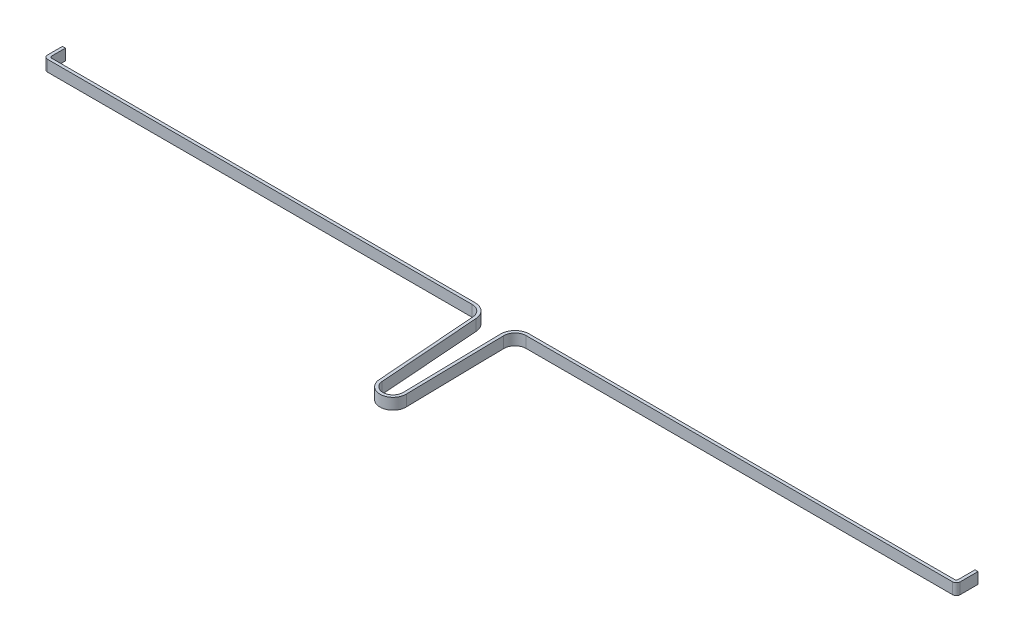
ISO-10303-21;
HEADER;
FILE_DESCRIPTION(('STEP AP214'),'2;1');
FILE_NAME('part.step','',(''),(''),'','','');
FILE_SCHEMA(('AUTOMOTIVE_DESIGN { 1 0 10303 214 1 1 1 1 }'));
ENDSEC;
DATA;
#1=APPLICATION_CONTEXT('core data for automotive mechanical design processes');
#2=APPLICATION_PROTOCOL_DEFINITION('international standard','automotive_design',2000,#1);
#3=PRODUCT_CONTEXT('',#1,'mechanical');
#4=PRODUCT('Part','Part','',(#3));
#5=PRODUCT_RELATED_PRODUCT_CATEGORY('part','',(#4));
#6=PRODUCT_DEFINITION_FORMATION('','',#4);
#7=PRODUCT_DEFINITION_CONTEXT('part definition',#1,'design');
#8=PRODUCT_DEFINITION('design','',#6,#7);
#9=PRODUCT_DEFINITION_SHAPE('','',#8);
#10=(LENGTH_UNIT() NAMED_UNIT(*) SI_UNIT(.MILLI.,.METRE.));
#11=(NAMED_UNIT(*) PLANE_ANGLE_UNIT() SI_UNIT($,.RADIAN.));
#12=(NAMED_UNIT(*) SI_UNIT($,.STERADIAN.) SOLID_ANGLE_UNIT());
#13=UNCERTAINTY_MEASURE_WITH_UNIT(LENGTH_MEASURE(1.E-05),#10,'distance_accuracy_value','');
#14=(GEOMETRIC_REPRESENTATION_CONTEXT(3) GLOBAL_UNCERTAINTY_ASSIGNED_CONTEXT((#13)) GLOBAL_UNIT_ASSIGNED_CONTEXT((#10,
#11,#12)) REPRESENTATION_CONTEXT('',''));
#15=CARTESIAN_POINT('',(0.,0.,0.));
#16=DIRECTION('',(0.,0.,1.));
#17=DIRECTION('',(1.,0.,0.));
#18=AXIS2_PLACEMENT_3D('',#15,#16,#17);
#19=CARTESIAN_POINT('',(-245.4,6.,0.));
#20=DIRECTION('',(1.,0.,0.));
#21=DIRECTION('',(0.,0.,-1.));
#22=AXIS2_PLACEMENT_3D('',#19,#20,#21);
#23=PLANE('',#22);
#24=DIRECTION('',(0.,0.,1.));
#25=VECTOR('',#24,1.);
#26=CARTESIAN_POINT('',(-245.4,6.,0.));
#27=LINE('',#26,#25);
#28=CARTESIAN_POINT('',(-245.4,6.,-69.5));
#29=VERTEX_POINT('',#28);
#30=CARTESIAN_POINT('',(-245.4,6.,-62.1));
#31=VERTEX_POINT('',#30);
#32=EDGE_CURVE('E199',#29,#31,#27,.T.);
#33=ORIENTED_EDGE('',*,*,#32,.T.);
#34=DIRECTION('',(0.,-1.,0.));
#35=VECTOR('',#34,1.);
#36=CARTESIAN_POINT('',(-245.4,6.,-62.1));
#37=LINE('',#36,#35);
#38=CARTESIAN_POINT('',(-245.4,0.,-62.1));
#39=VERTEX_POINT('',#38);
#40=EDGE_CURVE('E207',#31,#39,#37,.T.);
#41=ORIENTED_EDGE('',*,*,#40,.T.);
#42=DIRECTION('',(0.,0.,1.));
#43=VECTOR('',#42,1.);
#44=CARTESIAN_POINT('',(-245.4,0.,0.));
#45=LINE('',#44,#43);
#46=CARTESIAN_POINT('',(-245.4,0.,-69.5));
#47=VERTEX_POINT('',#46);
#48=EDGE_CURVE('E202',#47,#39,#45,.T.);
#49=ORIENTED_EDGE('',*,*,#48,.F.);
#50=DIRECTION('',(0.,-1.,0.));
#51=VECTOR('',#50,1.);
#52=CARTESIAN_POINT('',(-245.4,6.,-69.5));
#53=LINE('',#52,#51);
#54=EDGE_CURVE('E196',#29,#47,#53,.T.);
#55=ORIENTED_EDGE('',*,*,#54,.F.);
#56=EDGE_LOOP('',(#33,#41,#49,#55));
#57=FACE_BOUND('',#56,.T.);
#58=ADVANCED_FACE('F35',(#57),#23,.T.);
#59=CARTESIAN_POINT('',(0.,6.,-69.5));
#60=DIRECTION('',(0.,0.,-1.));
#61=DIRECTION('',(-1.,0.,0.));
#62=AXIS2_PLACEMENT_3D('',#59,#60,#61);
#63=PLANE('',#62);
#64=DIRECTION('',(1.,0.,0.));
#65=VECTOR('',#64,1.);
#66=CARTESIAN_POINT('',(0.,0.,-69.5));
#67=LINE('',#66,#65);
#68=CARTESIAN_POINT('',(-247.,0.,-69.5));
#69=VERTEX_POINT('',#68);
#70=EDGE_CURVE('E269',#69,#47,#67,.T.);
#71=ORIENTED_EDGE('',*,*,#70,.F.);
#72=DIRECTION('',(0.,-1.,0.));
#73=VECTOR('',#72,1.);
#74=CARTESIAN_POINT('',(-247.,6.,-69.5));
#75=LINE('',#74,#73);
#76=CARTESIAN_POINT('',(-247.,6.,-69.5));
#77=VERTEX_POINT('',#76);
#78=EDGE_CURVE('E208',#77,#69,#75,.T.);
#79=ORIENTED_EDGE('',*,*,#78,.F.);
#80=DIRECTION('',(1.,0.,0.));
#81=VECTOR('',#80,1.);
#82=CARTESIAN_POINT('',(0.,6.,-69.5));
#83=LINE('',#82,#81);
#84=EDGE_CURVE('E213',#77,#29,#83,.T.);
#85=ORIENTED_EDGE('',*,*,#84,.T.);
#86=ORIENTED_EDGE('',*,*,#54,.T.);
#87=EDGE_LOOP('',(#71,#79,#85,#86));
#88=FACE_BOUND('',#87,.T.);
#89=ADVANCED_FACE('F220',(#88),#63,.T.);
#90=CARTESIAN_POINT('',(-247.,6.,0.));
#91=DIRECTION('',(-1.,0.,0.));
#92=DIRECTION('',(0.,0.,1.));
#93=AXIS2_PLACEMENT_3D('',#90,#91,#92);
#94=PLANE('',#93);
#95=DIRECTION('',(0.,0.,-1.));
#96=VECTOR('',#95,1.);
#97=CARTESIAN_POINT('',(-247.,0.,0.));
#98=LINE('',#97,#96);
#99=CARTESIAN_POINT('',(-247.,0.,-61.5));
#100=VERTEX_POINT('',#99);
#101=EDGE_CURVE('E271',#100,#69,#98,.T.);
#102=ORIENTED_EDGE('',*,*,#101,.F.);
#103=DIRECTION('',(0.,-1.,0.));
#104=VECTOR('',#103,1.);
#105=CARTESIAN_POINT('',(-247.,6.,-61.5));
#106=LINE('',#105,#104);
#107=CARTESIAN_POINT('',(-247.,6.,-61.5));
#108=VERTEX_POINT('',#107);
#109=EDGE_CURVE('E11',#100,#108,#106,.F.);
#110=ORIENTED_EDGE('',*,*,#109,.T.);
#111=DIRECTION('',(0.,0.,-1.));
#112=VECTOR('',#111,1.);
#113=CARTESIAN_POINT('',(-247.,6.,0.));
#114=LINE('',#113,#112);
#115=EDGE_CURVE('E222',#108,#77,#114,.T.);
#116=ORIENTED_EDGE('',*,*,#115,.T.);
#117=ORIENTED_EDGE('',*,*,#78,.T.);
#118=EDGE_LOOP('',(#102,#110,#116,#117));
#119=FACE_BOUND('',#118,.T.);
#120=ADVANCED_FACE('F467',(#119),#94,.T.);
#121=CARTESIAN_POINT('',(0.,6.,-59.5));
#122=DIRECTION('',(0.,0.,1.));
#123=DIRECTION('',(1.,0.,0.));
#124=AXIS2_PLACEMENT_3D('',#121,#122,#123);
#125=PLANE('',#124);
#126=DIRECTION('',(-1.,0.,0.));
#127=VECTOR('',#126,1.);
#128=CARTESIAN_POINT('',(0.,6.,-59.5));
#129=LINE('',#128,#127);
#130=CARTESIAN_POINT('',(-17.,6.,-59.5));
#131=VERTEX_POINT('',#130);
#132=CARTESIAN_POINT('',(-245.,6.,-59.5));
#133=VERTEX_POINT('',#132);
#134=EDGE_CURVE('E224',#131,#133,#129,.T.);
#135=ORIENTED_EDGE('',*,*,#134,.T.);
#136=DIRECTION('',(0.,-1.,0.));
#137=VECTOR('',#136,1.);
#138=CARTESIAN_POINT('',(-245.,6.,-59.5));
#139=LINE('',#138,#137);
#140=CARTESIAN_POINT('',(-245.,0.,-59.5));
#141=VERTEX_POINT('',#140);
#142=EDGE_CURVE('E43',#133,#141,#139,.T.);
#143=ORIENTED_EDGE('',*,*,#142,.T.);
#144=DIRECTION('',(-1.,0.,0.));
#145=VECTOR('',#144,1.);
#146=CARTESIAN_POINT('',(0.,0.,-59.5));
#147=LINE('',#146,#145);
#148=CARTESIAN_POINT('',(-17.,0.,-59.5));
#149=VERTEX_POINT('',#148);
#150=EDGE_CURVE('E273',#149,#141,#147,.T.);
#151=ORIENTED_EDGE('',*,*,#150,.F.);
#152=DIRECTION('',(0.,-1.,0.));
#153=VECTOR('',#152,1.);
#154=CARTESIAN_POINT('',(-17.,6.,-59.5));
#155=LINE('',#154,#153);
#156=EDGE_CURVE('E348',#131,#149,#155,.T.);
#157=ORIENTED_EDGE('',*,*,#156,.F.);
#158=EDGE_LOOP('',(#135,#143,#151,#157));
#159=FACE_BOUND('',#158,.T.);
#160=ADVANCED_FACE('F381',(#159),#125,.T.);
#161=CARTESIAN_POINT('',(-17.,6.,-53.5));
#162=DIRECTION('',(0.,-1.,0.));
#163=DIRECTION('',(0.,0.,-1.));
#164=AXIS2_PLACEMENT_3D('',#161,#162,#163);
#165=CYLINDRICAL_SURFACE('',#164,6.);
#166=CARTESIAN_POINT('',(-17.,0.,-53.5));
#167=DIRECTION('',(0.,1.,0.));
#168=DIRECTION('',(0.,0.,1.));
#169=AXIS2_PLACEMENT_3D('',#166,#167,#168);
#170=CIRCLE('',#169,6.);
#171=CARTESIAN_POINT('',(-11.016404973248,0.,-53.9433853356035));
#172=VERTEX_POINT('',#171);
#173=EDGE_CURVE('E276',#172,#149,#170,.T.);
#174=ORIENTED_EDGE('',*,*,#173,.F.);
#175=DIRECTION('',(0.,-1.,0.));
#176=VECTOR('',#175,1.);
#177=CARTESIAN_POINT('',(-11.016404973248,6.,-53.9433853356035));
#178=LINE('',#177,#176);
#179=CARTESIAN_POINT('',(-11.016404973248,6.,-53.9433853356035));
#180=VERTEX_POINT('',#179);
#181=EDGE_CURVE('E346',#180,#172,#178,.T.);
#182=ORIENTED_EDGE('',*,*,#181,.F.);
#183=CARTESIAN_POINT('',(-17.,6.,-53.5));
#184=DIRECTION('',(0.,1.,0.));
#185=DIRECTION('',(0.,0.,1.));
#186=AXIS2_PLACEMENT_3D('',#183,#184,#185);
#187=CIRCLE('',#186,6.);
#188=EDGE_CURVE('E228',#180,#131,#187,.T.);
#189=ORIENTED_EDGE('',*,*,#188,.T.);
#190=ORIENTED_EDGE('',*,*,#156,.T.);
#191=EDGE_LOOP('',(#174,#182,#189,#190));
#192=FACE_BOUND('',#191,.T.);
#193=ADVANCED_FACE('F390',(#192),#165,.F.);
#194=CARTESIAN_POINT('',(-6.98086086454405,6.,0.517282891537364));
#195=DIRECTION('',(0.997265837792008,0.,-0.0738975559339091));
#196=DIRECTION('',(-0.0738975559339091,0.,-0.997265837792008));
#197=AXIS2_PLACEMENT_3D('',#194,#195,#196);
#198=PLANE('',#197);
#199=DIRECTION('',(0.0738975559339091,0.,0.997265837792008));
#200=VECTOR('',#199,1.);
#201=CARTESIAN_POINT('',(-6.98086086454405,0.,0.517282891537364));
#202=LINE('',#201,#200);
#203=CARTESIAN_POINT('',(-6.98086086454405,0.,0.517282891537364));
#204=VERTEX_POINT('',#203);
#205=EDGE_CURVE('E279',#172,#204,#202,.T.);
#206=ORIENTED_EDGE('',*,*,#205,.T.);
#207=DIRECTION('',(0.,-1.,0.));
#208=VECTOR('',#207,1.);
#209=CARTESIAN_POINT('',(-6.98086086454405,6.,0.517282891537364));
#210=LINE('',#209,#208);
#211=CARTESIAN_POINT('',(-6.98086086454405,6.,0.517282891537364));
#212=VERTEX_POINT('',#211);
#213=EDGE_CURVE('E343',#212,#204,#210,.T.);
#214=ORIENTED_EDGE('',*,*,#213,.F.);
#215=DIRECTION('',(0.0738975559339091,0.,0.997265837792008));
#216=VECTOR('',#215,1.);
#217=CARTESIAN_POINT('',(-6.98086086454405,6.,0.517282891537364));
#218=LINE('',#217,#216);
#219=EDGE_CURVE('E231',#180,#212,#218,.T.);
#220=ORIENTED_EDGE('',*,*,#219,.F.);
#221=ORIENTED_EDGE('',*,*,#181,.T.);
#222=EDGE_LOOP('',(#206,#214,#220,#221));
#223=FACE_BOUND('',#222,.T.);
#224=ADVANCED_FACE('F398',(#223),#198,.F.);
#225=CARTESIAN_POINT('',(0.,6.,0.));
#226=DIRECTION('',(0.,-1.,0.));
#227=DIRECTION('',(0.,0.,-1.));
#228=AXIS2_PLACEMENT_3D('',#225,#226,#227);
#229=CYLINDRICAL_SURFACE('',#228,7.);
#230=CARTESIAN_POINT('',(0.,0.,0.));
#231=DIRECTION('',(0.,1.,0.));
#232=DIRECTION('',(0.,0.,1.));
#233=AXIS2_PLACEMENT_3D('',#230,#231,#232);
#234=CIRCLE('',#233,7.);
#235=CARTESIAN_POINT('',(6.99877192391799,0.,-0.13111657781279));
#236=VERTEX_POINT('',#235);
#237=EDGE_CURVE('E281',#204,#236,#234,.T.);
#238=ORIENTED_EDGE('',*,*,#237,.T.);
#239=DIRECTION('',(0.,-1.,0.));
#240=VECTOR('',#239,1.);
#241=CARTESIAN_POINT('',(6.99877192391799,6.,-0.13111657781279));
#242=LINE('',#241,#240);
#243=CARTESIAN_POINT('',(6.99877192391799,6.,-0.13111657781279));
#244=VERTEX_POINT('',#243);
#245=EDGE_CURVE('E341',#244,#236,#242,.T.);
#246=ORIENTED_EDGE('',*,*,#245,.F.);
#247=CARTESIAN_POINT('',(0.,6.,0.));
#248=DIRECTION('',(0.,1.,0.));
#249=DIRECTION('',(0.,0.,1.));
#250=AXIS2_PLACEMENT_3D('',#247,#248,#249);
#251=CIRCLE('',#250,7.);
#252=EDGE_CURVE('E233',#212,#244,#251,.T.);
#253=ORIENTED_EDGE('',*,*,#252,.F.);
#254=ORIENTED_EDGE('',*,*,#213,.T.);
#255=EDGE_LOOP('',(#238,#246,#253,#254));
#256=FACE_BOUND('',#255,.T.);
#257=ADVANCED_FACE('F400',(#256),#229,.T.);
#258=CARTESIAN_POINT('',(6.99877192391799,6.,-0.131116577812789));
#259=DIRECTION('',(0.999824560559712,0.,-0.0187309396875413));
#260=DIRECTION('',(-0.0187309396875413,0.,-0.999824560559712));
#261=AXIS2_PLACEMENT_3D('',#258,#259,#260);
#262=PLANE('',#261);
#263=DIRECTION('',(0.0187309396875413,0.,0.999824560559712));
#264=VECTOR('',#263,1.);
#265=CARTESIAN_POINT('',(6.99877192391799,0.,-0.131116577812789));
#266=LINE('',#265,#264);
#267=CARTESIAN_POINT('',(6.00105263664172,0.,-53.3876143618748));
#268=VERTEX_POINT('',#267);
#269=EDGE_CURVE('E284',#268,#236,#266,.T.);
#270=ORIENTED_EDGE('',*,*,#269,.F.);
#271=DIRECTION('',(0.,-1.,0.));
#272=VECTOR('',#271,1.);
#273=CARTESIAN_POINT('',(6.00105263664172,6.,-53.3876143618748));
#274=LINE('',#273,#272);
#275=CARTESIAN_POINT('',(6.00105263664172,6.,-53.3876143618748));
#276=VERTEX_POINT('',#275);
#277=EDGE_CURVE('E339',#276,#268,#274,.T.);
#278=ORIENTED_EDGE('',*,*,#277,.F.);
#279=DIRECTION('',(0.0187309396875413,0.,0.999824560559712));
#280=VECTOR('',#279,1.);
#281=CARTESIAN_POINT('',(6.99877192391799,6.,-0.131116577812789));
#282=LINE('',#281,#280);
#283=EDGE_CURVE('E235',#276,#244,#282,.T.);
#284=ORIENTED_EDGE('',*,*,#283,.T.);
#285=ORIENTED_EDGE('',*,*,#245,.T.);
#286=EDGE_LOOP('',(#270,#278,#284,#285));
#287=FACE_BOUND('',#286,.T.);
#288=ADVANCED_FACE('F403',(#287),#262,.T.);
#289=CARTESIAN_POINT('',(12.,6.,-53.5));
#290=DIRECTION('',(0.,-1.,0.));
#291=DIRECTION('',(0.,0.,-1.));
#292=AXIS2_PLACEMENT_3D('',#289,#290,#291);
#293=CYLINDRICAL_SURFACE('',#292,6.);
#294=CARTESIAN_POINT('',(12.,0.,-53.5));
#295=DIRECTION('',(0.,1.,0.));
#296=DIRECTION('',(0.,0.,1.));
#297=AXIS2_PLACEMENT_3D('',#294,#295,#296);
#298=CIRCLE('',#297,6.);
#299=CARTESIAN_POINT('',(12.,0.,-59.5));
#300=VERTEX_POINT('',#299);
#301=EDGE_CURVE('E287',#300,#268,#298,.T.);
#302=ORIENTED_EDGE('',*,*,#301,.F.);
#303=DIRECTION('',(0.,-1.,0.));
#304=VECTOR('',#303,1.);
#305=CARTESIAN_POINT('',(12.,6.,-59.5));
#306=LINE('',#305,#304);
#307=CARTESIAN_POINT('',(12.,6.,-59.5));
#308=VERTEX_POINT('',#307);
#309=EDGE_CURVE('E337',#308,#300,#306,.T.);
#310=ORIENTED_EDGE('',*,*,#309,.F.);
#311=CARTESIAN_POINT('',(12.,6.,-53.5));
#312=DIRECTION('',(0.,1.,0.));
#313=DIRECTION('',(0.,0.,1.));
#314=AXIS2_PLACEMENT_3D('',#311,#312,#313);
#315=CIRCLE('',#314,6.);
#316=EDGE_CURVE('E238',#308,#276,#315,.T.);
#317=ORIENTED_EDGE('',*,*,#316,.T.);
#318=ORIENTED_EDGE('',*,*,#277,.T.);
#319=EDGE_LOOP('',(#302,#310,#317,#318));
#320=FACE_BOUND('',#319,.T.);
#321=ADVANCED_FACE('F407',(#320),#293,.F.);
#322=CARTESIAN_POINT('',(0.,6.,-59.5));
#323=DIRECTION('',(0.,0.,-1.));
#324=DIRECTION('',(-1.,0.,0.));
#325=AXIS2_PLACEMENT_3D('',#322,#323,#324);
#326=PLANE('',#325);
#327=DIRECTION('',(1.,0.,0.));
#328=VECTOR('',#327,1.);
#329=CARTESIAN_POINT('',(0.,0.,-59.5));
#330=LINE('',#329,#328);
#331=CARTESIAN_POINT('',(241.,0.,-59.5));
#332=VERTEX_POINT('',#331);
#333=EDGE_CURVE('E290',#300,#332,#330,.T.);
#334=ORIENTED_EDGE('',*,*,#333,.T.);
#335=DIRECTION('',(0.,-1.,0.));
#336=VECTOR('',#335,1.);
#337=CARTESIAN_POINT('',(241.,6.,-59.5));
#338=LINE('',#337,#336);
#339=CARTESIAN_POINT('',(241.,6.,-59.5));
#340=VERTEX_POINT('',#339);
#341=EDGE_CURVE('E373',#332,#340,#338,.F.);
#342=ORIENTED_EDGE('',*,*,#341,.T.);
#343=DIRECTION('',(1.,0.,0.));
#344=VECTOR('',#343,1.);
#345=CARTESIAN_POINT('',(0.,6.,-59.5));
#346=LINE('',#345,#344);
#347=EDGE_CURVE('E241',#308,#340,#346,.T.);
#348=ORIENTED_EDGE('',*,*,#347,.F.);
#349=ORIENTED_EDGE('',*,*,#309,.T.);
#350=EDGE_LOOP('',(#334,#342,#348,#349));
#351=FACE_BOUND('',#350,.T.);
#352=ADVANCED_FACE('F411',(#351),#326,.F.);
#353=CARTESIAN_POINT('',(243.,6.,0.));
#354=DIRECTION('',(-1.,0.,0.));
#355=DIRECTION('',(0.,0.,1.));
#356=AXIS2_PLACEMENT_3D('',#353,#354,#355);
#357=PLANE('',#356);
#358=DIRECTION('',(0.,0.,-1.));
#359=VECTOR('',#358,1.);
#360=CARTESIAN_POINT('',(243.,6.,0.));
#361=LINE('',#360,#359);
#362=CARTESIAN_POINT('',(243.,6.,-61.5));
#363=VERTEX_POINT('',#362);
#364=CARTESIAN_POINT('',(243.,6.,-71.1));
#365=VERTEX_POINT('',#364);
#366=EDGE_CURVE('E243',#363,#365,#361,.T.);
#367=ORIENTED_EDGE('',*,*,#366,.F.);
#368=DIRECTION('',(0.,-1.,0.));
#369=VECTOR('',#368,1.);
#370=CARTESIAN_POINT('',(243.,6.,-61.5));
#371=LINE('',#370,#369);
#372=CARTESIAN_POINT('',(243.,0.,-61.5));
#373=VERTEX_POINT('',#372);
#374=EDGE_CURVE('E366',#363,#373,#371,.T.);
#375=ORIENTED_EDGE('',*,*,#374,.T.);
#376=DIRECTION('',(0.,0.,-1.));
#377=VECTOR('',#376,1.);
#378=CARTESIAN_POINT('',(243.,0.,0.));
#379=LINE('',#378,#377);
#380=CARTESIAN_POINT('',(243.,0.,-71.1));
#381=VERTEX_POINT('',#380);
#382=EDGE_CURVE('E293',#373,#381,#379,.T.);
#383=ORIENTED_EDGE('',*,*,#382,.T.);
#384=DIRECTION('',(0.,-1.,0.));
#385=VECTOR('',#384,1.);
#386=CARTESIAN_POINT('',(243.,6.,-71.1));
#387=LINE('',#386,#385);
#388=EDGE_CURVE('E334',#365,#381,#387,.T.);
#389=ORIENTED_EDGE('',*,*,#388,.F.);
#390=EDGE_LOOP('',(#367,#375,#383,#389));
#391=FACE_BOUND('',#390,.T.);
#392=ADVANCED_FACE('F419',(#391),#357,.F.);
#393=CARTESIAN_POINT('',(0.,6.,-71.1));
#394=DIRECTION('',(0.,0.,1.));
#395=DIRECTION('',(1.,0.,0.));
#396=AXIS2_PLACEMENT_3D('',#393,#394,#395);
#397=PLANE('',#396);
#398=DIRECTION('',(-1.,0.,0.));
#399=VECTOR('',#398,1.);
#400=CARTESIAN_POINT('',(0.,0.,-71.1));
#401=LINE('',#400,#399);
#402=CARTESIAN_POINT('',(241.4,0.,-71.1));
#403=VERTEX_POINT('',#402);
#404=EDGE_CURVE('E295',#381,#403,#401,.T.);
#405=ORIENTED_EDGE('',*,*,#404,.T.);
#406=DIRECTION('',(0.,-1.,0.));
#407=VECTOR('',#406,1.);
#408=CARTESIAN_POINT('',(241.4,6.,-71.1));
#409=LINE('',#408,#407);
#410=CARTESIAN_POINT('',(241.4,6.,-71.1));
#411=VERTEX_POINT('',#410);
#412=EDGE_CURVE('E331',#411,#403,#409,.T.);
#413=ORIENTED_EDGE('',*,*,#412,.F.);
#414=DIRECTION('',(-1.,0.,0.));
#415=VECTOR('',#414,1.);
#416=CARTESIAN_POINT('',(0.,6.,-71.1));
#417=LINE('',#416,#415);
#418=EDGE_CURVE('E245',#365,#411,#417,.T.);
#419=ORIENTED_EDGE('',*,*,#418,.F.);
#420=ORIENTED_EDGE('',*,*,#388,.T.);
#421=EDGE_LOOP('',(#405,#413,#419,#420));
#422=FACE_BOUND('',#421,.T.);
#423=ADVANCED_FACE('F425',(#422),#397,.F.);
#424=CARTESIAN_POINT('',(241.4,6.,0.));
#425=DIRECTION('',(1.,0.,0.));
#426=DIRECTION('',(0.,0.,-1.));
#427=AXIS2_PLACEMENT_3D('',#424,#425,#426);
#428=PLANE('',#427);
#429=DIRECTION('',(0.,0.,1.));
#430=VECTOR('',#429,1.);
#431=CARTESIAN_POINT('',(241.4,0.,0.));
#432=LINE('',#431,#430);
#433=CARTESIAN_POINT('',(241.4,0.,-62.1));
#434=VERTEX_POINT('',#433);
#435=EDGE_CURVE('E297',#403,#434,#432,.T.);
#436=ORIENTED_EDGE('',*,*,#435,.T.);
#437=DIRECTION('',(0.,-1.,0.));
#438=VECTOR('',#437,1.);
#439=CARTESIAN_POINT('',(241.4,6.,-62.1));
#440=LINE('',#439,#438);
#441=CARTESIAN_POINT('',(241.4,6.,-62.1));
#442=VERTEX_POINT('',#441);
#443=EDGE_CURVE('E357',#434,#442,#440,.F.);
#444=ORIENTED_EDGE('',*,*,#443,.T.);
#445=DIRECTION('',(0.,0.,1.));
#446=VECTOR('',#445,1.);
#447=CARTESIAN_POINT('',(241.4,6.,0.));
#448=LINE('',#447,#446);
#449=EDGE_CURVE('E247',#411,#442,#448,.T.);
#450=ORIENTED_EDGE('',*,*,#449,.F.);
#451=ORIENTED_EDGE('',*,*,#412,.T.);
#452=EDGE_LOOP('',(#436,#444,#450,#451));
#453=FACE_BOUND('',#452,.T.);
#454=ADVANCED_FACE('F429',(#453),#428,.F.);
#455=CARTESIAN_POINT('',(0.,6.,-61.1));
#456=DIRECTION('',(0.,0.,-1.));
#457=DIRECTION('',(-1.,0.,0.));
#458=AXIS2_PLACEMENT_3D('',#455,#456,#457);
#459=PLANE('',#458);
#460=DIRECTION('',(1.,0.,0.));
#461=VECTOR('',#460,1.);
#462=CARTESIAN_POINT('',(0.,6.,-61.1));
#463=LINE('',#462,#461);
#464=CARTESIAN_POINT('',(12.,6.,-61.1));
#465=VERTEX_POINT('',#464);
#466=CARTESIAN_POINT('',(240.4,6.,-61.1));
#467=VERTEX_POINT('',#466);
#468=EDGE_CURVE('E250',#465,#467,#463,.T.);
#469=ORIENTED_EDGE('',*,*,#468,.T.);
#470=DIRECTION('',(0.,-1.,0.));
#471=VECTOR('',#470,1.);
#472=CARTESIAN_POINT('',(240.4,6.,-61.1));
#473=LINE('',#472,#471);
#474=CARTESIAN_POINT('',(240.4,0.,-61.1));
#475=VERTEX_POINT('',#474);
#476=EDGE_CURVE('E354',#467,#475,#473,.T.);
#477=ORIENTED_EDGE('',*,*,#476,.T.);
#478=DIRECTION('',(1.,0.,0.));
#479=VECTOR('',#478,1.);
#480=CARTESIAN_POINT('',(0.,0.,-61.1));
#481=LINE('',#480,#479);
#482=CARTESIAN_POINT('',(12.,0.,-61.1));
#483=VERTEX_POINT('',#482);
#484=EDGE_CURVE('E300',#483,#475,#481,.T.);
#485=ORIENTED_EDGE('',*,*,#484,.F.);
#486=DIRECTION('',(0.,-1.,0.));
#487=VECTOR('',#486,1.);
#488=CARTESIAN_POINT('',(12.,6.,-61.1));
#489=LINE('',#488,#487);
#490=EDGE_CURVE('E329',#465,#483,#489,.T.);
#491=ORIENTED_EDGE('',*,*,#490,.F.);
#492=EDGE_LOOP('',(#469,#477,#485,#491));
#493=FACE_BOUND('',#492,.T.);
#494=ADVANCED_FACE('F438',(#493),#459,.T.);
#495=CARTESIAN_POINT('',(12.,6.,-53.5));
#496=DIRECTION('',(0.,-1.,0.));
#497=DIRECTION('',(0.,0.,-1.));
#498=AXIS2_PLACEMENT_3D('',#495,#496,#497);
#499=CYLINDRICAL_SURFACE('',#498,7.6);
#500=CARTESIAN_POINT('',(12.,0.,-53.5));
#501=DIRECTION('',(0.,1.,0.));
#502=DIRECTION('',(0.,0.,1.));
#503=AXIS2_PLACEMENT_3D('',#500,#501,#502);
#504=CIRCLE('',#503,7.6);
#505=CARTESIAN_POINT('',(4.40133333974618,0.,-53.3576448583747));
#506=VERTEX_POINT('',#505);
#507=EDGE_CURVE('E303',#483,#506,#504,.T.);
#508=ORIENTED_EDGE('',*,*,#507,.T.);
#509=DIRECTION('',(0.,-1.,0.));
#510=VECTOR('',#509,1.);
#511=CARTESIAN_POINT('',(4.40133333974618,6.,-53.3576448583747));
#512=LINE('',#511,#510);
#513=CARTESIAN_POINT('',(4.40133333974618,6.,-53.3576448583747));
#514=VERTEX_POINT('',#513);
#515=EDGE_CURVE('E326',#514,#506,#512,.T.);
#516=ORIENTED_EDGE('',*,*,#515,.F.);
#517=CARTESIAN_POINT('',(12.,6.,-53.5));
#518=DIRECTION('',(0.,1.,0.));
#519=DIRECTION('',(0.,0.,1.));
#520=AXIS2_PLACEMENT_3D('',#517,#518,#519);
#521=CIRCLE('',#520,7.6);
#522=EDGE_CURVE('E253',#465,#514,#521,.T.);
#523=ORIENTED_EDGE('',*,*,#522,.F.);
#524=ORIENTED_EDGE('',*,*,#490,.T.);
#525=EDGE_LOOP('',(#508,#516,#523,#524));
#526=FACE_BOUND('',#525,.T.);
#527=ADVANCED_FACE('F443',(#526),#499,.T.);
#528=CARTESIAN_POINT('',(5.39905262702245,6.,-0.101147074312723));
#529=DIRECTION('',(0.999824560559712,0.,-0.0187309396875413));
#530=DIRECTION('',(-0.0187309396875413,0.,-0.999824560559712));
#531=AXIS2_PLACEMENT_3D('',#528,#529,#530);
#532=PLANE('',#531);
#533=DIRECTION('',(0.0187309396875413,0.,0.999824560559712));
#534=VECTOR('',#533,1.);
#535=CARTESIAN_POINT('',(5.39905262702245,0.,-0.101147074312723));
#536=LINE('',#535,#534);
#537=CARTESIAN_POINT('',(5.39905262702245,0.,-0.101147074312725));
#538=VERTEX_POINT('',#537);
#539=EDGE_CURVE('E305',#506,#538,#536,.T.);
#540=ORIENTED_EDGE('',*,*,#539,.T.);
#541=DIRECTION('',(0.,-1.,0.));
#542=VECTOR('',#541,1.);
#543=CARTESIAN_POINT('',(5.39905262702245,6.,-0.101147074312725));
#544=LINE('',#543,#542);
#545=CARTESIAN_POINT('',(5.39905262702245,6.,-0.101147074312725));
#546=VERTEX_POINT('',#545);
#547=EDGE_CURVE('E324',#546,#538,#544,.T.);
#548=ORIENTED_EDGE('',*,*,#547,.F.);
#549=DIRECTION('',(0.0187309396875413,0.,0.999824560559712));
#550=VECTOR('',#549,1.);
#551=CARTESIAN_POINT('',(5.39905262702245,6.,-0.101147074312723));
#552=LINE('',#551,#550);
#553=EDGE_CURVE('E255',#514,#546,#552,.T.);
#554=ORIENTED_EDGE('',*,*,#553,.F.);
#555=ORIENTED_EDGE('',*,*,#515,.T.);
#556=EDGE_LOOP('',(#540,#548,#554,#555));
#557=FACE_BOUND('',#556,.T.);
#558=ADVANCED_FACE('F447',(#557),#532,.F.);
#559=CARTESIAN_POINT('',(0.,6.,0.));
#560=DIRECTION('',(0.,-1.,0.));
#561=DIRECTION('',(0.,0.,-1.));
#562=AXIS2_PLACEMENT_3D('',#559,#560,#561);
#563=CYLINDRICAL_SURFACE('',#562,5.4);
#564=CARTESIAN_POINT('',(0.,0.,0.));
#565=DIRECTION('',(0.,1.,0.));
#566=DIRECTION('',(0.,0.,1.));
#567=AXIS2_PLACEMENT_3D('',#564,#565,#566);
#568=CIRCLE('',#567,5.4);
#569=CARTESIAN_POINT('',(-5.38523552407684,0.,0.399046802043109));
#570=VERTEX_POINT('',#569);
#571=EDGE_CURVE('E308',#570,#538,#568,.T.);
#572=ORIENTED_EDGE('',*,*,#571,.F.);
#573=DIRECTION('',(0.,-1.,0.));
#574=VECTOR('',#573,1.);
#575=CARTESIAN_POINT('',(-5.38523552407684,6.,0.399046802043109));
#576=LINE('',#575,#574);
#577=CARTESIAN_POINT('',(-5.38523552407684,6.,0.399046802043109));
#578=VERTEX_POINT('',#577);
#579=EDGE_CURVE('E322',#578,#570,#576,.T.);
#580=ORIENTED_EDGE('',*,*,#579,.F.);
#581=CARTESIAN_POINT('',(0.,6.,0.));
#582=DIRECTION('',(0.,1.,0.));
#583=DIRECTION('',(0.,0.,1.));
#584=AXIS2_PLACEMENT_3D('',#581,#582,#583);
#585=CIRCLE('',#584,5.4);
#586=EDGE_CURVE('E257',#578,#546,#585,.T.);
#587=ORIENTED_EDGE('',*,*,#586,.T.);
#588=ORIENTED_EDGE('',*,*,#547,.T.);
#589=EDGE_LOOP('',(#572,#580,#587,#588));
#590=FACE_BOUND('',#589,.T.);
#591=ADVANCED_FACE('F624',(#590),#563,.F.);
#592=CARTESIAN_POINT('',(-5.38523552407684,6.,0.399046802043109));
#593=DIRECTION('',(0.997265837792008,0.,-0.0738975559339091));
#594=DIRECTION('',(-0.0738975559339091,0.,-0.997265837792008));
#595=AXIS2_PLACEMENT_3D('',#592,#593,#594);
#596=PLANE('',#595);
#597=DIRECTION('',(0.0738975559339091,0.,0.997265837792008));
#598=VECTOR('',#597,1.);
#599=CARTESIAN_POINT('',(-5.38523552407684,0.,0.399046802043109));
#600=LINE('',#599,#598);
#601=CARTESIAN_POINT('',(-9.42077963278075,0.,-54.0616214250977));
#602=VERTEX_POINT('',#601);
#603=EDGE_CURVE('E311',#602,#570,#600,.T.);
#604=ORIENTED_EDGE('',*,*,#603,.F.);
#605=DIRECTION('',(0.,-1.,0.));
#606=VECTOR('',#605,1.);
#607=CARTESIAN_POINT('',(-9.42077963278075,6.,-54.0616214250977));
#608=LINE('',#607,#606);
#609=CARTESIAN_POINT('',(-9.42077963278075,6.,-54.0616214250977));
#610=VERTEX_POINT('',#609);
#611=EDGE_CURVE('E320',#610,#602,#608,.T.);
#612=ORIENTED_EDGE('',*,*,#611,.F.);
#613=DIRECTION('',(0.0738975559339091,0.,0.997265837792008));
#614=VECTOR('',#613,1.);
#615=CARTESIAN_POINT('',(-5.38523552407684,6.,0.399046802043109));
#616=LINE('',#615,#614);
#617=EDGE_CURVE('E260',#610,#578,#616,.T.);
#618=ORIENTED_EDGE('',*,*,#617,.T.);
#619=ORIENTED_EDGE('',*,*,#579,.T.);
#620=EDGE_LOOP('',(#604,#612,#618,#619));
#621=FACE_BOUND('',#620,.T.);
#622=ADVANCED_FACE('F454',(#621),#596,.T.);
#623=CARTESIAN_POINT('',(-17.,6.,-53.5));
#624=DIRECTION('',(0.,-1.,0.));
#625=DIRECTION('',(0.,0.,-1.));
#626=AXIS2_PLACEMENT_3D('',#623,#624,#625);
#627=CYLINDRICAL_SURFACE('',#626,7.6);
#628=CARTESIAN_POINT('',(-17.,0.,-53.5));
#629=DIRECTION('',(0.,1.,0.));
#630=DIRECTION('',(0.,0.,1.));
#631=AXIS2_PLACEMENT_3D('',#628,#629,#630);
#632=CIRCLE('',#631,7.6);
#633=CARTESIAN_POINT('',(-17.,0.,-61.1));
#634=VERTEX_POINT('',#633);
#635=EDGE_CURVE('E314',#602,#634,#632,.T.);
#636=ORIENTED_EDGE('',*,*,#635,.T.);
#637=DIRECTION('',(0.,-1.,0.));
#638=VECTOR('',#637,1.);
#639=CARTESIAN_POINT('',(-17.,6.,-61.1));
#640=LINE('',#639,#638);
#641=CARTESIAN_POINT('',(-17.,6.,-61.1));
#642=VERTEX_POINT('',#641);
#643=EDGE_CURVE('E267',#642,#634,#640,.T.);
#644=ORIENTED_EDGE('',*,*,#643,.F.);
#645=CARTESIAN_POINT('',(-17.,6.,-53.5));
#646=DIRECTION('',(0.,1.,0.));
#647=DIRECTION('',(0.,0.,1.));
#648=AXIS2_PLACEMENT_3D('',#645,#646,#647);
#649=CIRCLE('',#648,7.6);
#650=EDGE_CURVE('E263',#610,#642,#649,.T.);
#651=ORIENTED_EDGE('',*,*,#650,.F.);
#652=ORIENTED_EDGE('',*,*,#611,.T.);
#653=EDGE_LOOP('',(#636,#644,#651,#652));
#654=FACE_BOUND('',#653,.T.);
#655=ADVANCED_FACE('F460',(#654),#627,.T.);
#656=CARTESIAN_POINT('',(0.,6.,-61.1));
#657=DIRECTION('',(0.,0.,1.));
#658=DIRECTION('',(1.,0.,0.));
#659=AXIS2_PLACEMENT_3D('',#656,#657,#658);
#660=PLANE('',#659);
#661=DIRECTION('',(-1.,0.,0.));
#662=VECTOR('',#661,1.);
#663=CARTESIAN_POINT('',(0.,0.,-61.1));
#664=LINE('',#663,#662);
#665=CARTESIAN_POINT('',(-244.4,0.,-61.1));
#666=VERTEX_POINT('',#665);
#667=EDGE_CURVE('E217',#634,#666,#664,.T.);
#668=ORIENTED_EDGE('',*,*,#667,.T.);
#669=DIRECTION('',(0.,-1.,0.));
#670=VECTOR('',#669,1.);
#671=CARTESIAN_POINT('',(-244.4,6.,-61.1));
#672=LINE('',#671,#670);
#673=CARTESIAN_POINT('',(-244.4,6.,-61.1));
#674=VERTEX_POINT('',#673);
#675=EDGE_CURVE('E352',#666,#674,#672,.F.);
#676=ORIENTED_EDGE('',*,*,#675,.T.);
#677=DIRECTION('',(-1.,0.,0.));
#678=VECTOR('',#677,1.);
#679=CARTESIAN_POINT('',(0.,6.,-61.1));
#680=LINE('',#679,#678);
#681=EDGE_CURVE('E265',#642,#674,#680,.T.);
#682=ORIENTED_EDGE('',*,*,#681,.F.);
#683=ORIENTED_EDGE('',*,*,#643,.T.);
#684=EDGE_LOOP('',(#668,#676,#682,#683));
#685=FACE_BOUND('',#684,.T.);
#686=ADVANCED_FACE('F515',(#685),#660,.F.);
#687=CARTESIAN_POINT('',(0.,6.,0.));
#688=DIRECTION('',(0.,1.,0.));
#689=DIRECTION('',(0.,0.,1.));
#690=AXIS2_PLACEMENT_3D('',#687,#688,#689);
#691=PLANE('',#690);
#692=ORIENTED_EDGE('',*,*,#347,.T.);
#693=CARTESIAN_POINT('',(241.,6.,-61.5));
#694=DIRECTION('',(0.,1.,0.));
#695=DIRECTION('',(0.,0.,1.));
#696=AXIS2_PLACEMENT_3D('',#693,#694,#695);
#697=CIRCLE('',#696,2.);
#698=EDGE_CURVE('E376',#340,#363,#697,.T.);
#699=ORIENTED_EDGE('',*,*,#698,.T.);
#700=ORIENTED_EDGE('',*,*,#366,.T.);
#701=ORIENTED_EDGE('',*,*,#418,.T.);
#702=ORIENTED_EDGE('',*,*,#449,.T.);
#703=CARTESIAN_POINT('',(240.4,6.,-62.1));
#704=DIRECTION('',(0.,1.,0.));
#705=DIRECTION('',(0.,0.,1.));
#706=AXIS2_PLACEMENT_3D('',#703,#704,#705);
#707=CIRCLE('',#706,1.);
#708=EDGE_CURVE('E364',#442,#467,#707,.F.);
#709=ORIENTED_EDGE('',*,*,#708,.T.);
#710=ORIENTED_EDGE('',*,*,#468,.F.);
#711=ORIENTED_EDGE('',*,*,#522,.T.);
#712=ORIENTED_EDGE('',*,*,#553,.T.);
#713=ORIENTED_EDGE('',*,*,#586,.F.);
#714=ORIENTED_EDGE('',*,*,#617,.F.);
#715=ORIENTED_EDGE('',*,*,#650,.T.);
#716=ORIENTED_EDGE('',*,*,#681,.T.);
#717=CARTESIAN_POINT('',(-244.4,6.,-62.1));
#718=DIRECTION('',(0.,1.,0.));
#719=DIRECTION('',(0.,0.,1.));
#720=AXIS2_PLACEMENT_3D('',#717,#718,#719);
#721=CIRCLE('',#720,1.);
#722=EDGE_CURVE('E216',#674,#31,#721,.F.);
#723=ORIENTED_EDGE('',*,*,#722,.T.);
#724=ORIENTED_EDGE('',*,*,#32,.F.);
#725=ORIENTED_EDGE('',*,*,#84,.F.);
#726=ORIENTED_EDGE('',*,*,#115,.F.);
#727=CARTESIAN_POINT('',(-245.,6.,-61.5));
#728=DIRECTION('',(0.,1.,0.));
#729=DIRECTION('',(0.,0.,1.));
#730=AXIS2_PLACEMENT_3D('',#727,#728,#729);
#731=CIRCLE('',#730,2.);
#732=EDGE_CURVE('E50',#108,#133,#731,.T.);
#733=ORIENTED_EDGE('',*,*,#732,.T.);
#734=ORIENTED_EDGE('',*,*,#134,.F.);
#735=ORIENTED_EDGE('',*,*,#188,.F.);
#736=ORIENTED_EDGE('',*,*,#219,.T.);
#737=ORIENTED_EDGE('',*,*,#252,.T.);
#738=ORIENTED_EDGE('',*,*,#283,.F.);
#739=ORIENTED_EDGE('',*,*,#316,.F.);
#740=EDGE_LOOP('',(#692,#699,#700,#701,#702,#709,#710,#711,#712,#713,#714,#715,#716,#723,#724,
#725,#726,#733,#734,#735,#736,#737,#738,#739));
#741=FACE_BOUND('',#740,.T.);
#742=ADVANCED_FACE('F212',(#741),#691,.T.);
#743=CARTESIAN_POINT('',(0.,0.,0.));
#744=DIRECTION('',(0.,1.,0.));
#745=DIRECTION('',(0.,0.,1.));
#746=AXIS2_PLACEMENT_3D('',#743,#744,#745);
#747=PLANE('',#746);
#748=ORIENTED_EDGE('',*,*,#382,.F.);
#749=CARTESIAN_POINT('',(241.,0.,-61.5));
#750=DIRECTION('',(0.,1.,0.));
#751=DIRECTION('',(0.,0.,1.));
#752=AXIS2_PLACEMENT_3D('',#749,#750,#751);
#753=CIRCLE('',#752,2.);
#754=EDGE_CURVE('E371',#373,#332,#753,.F.);
#755=ORIENTED_EDGE('',*,*,#754,.T.);
#756=ORIENTED_EDGE('',*,*,#333,.F.);
#757=ORIENTED_EDGE('',*,*,#301,.T.);
#758=ORIENTED_EDGE('',*,*,#269,.T.);
#759=ORIENTED_EDGE('',*,*,#237,.F.);
#760=ORIENTED_EDGE('',*,*,#205,.F.);
#761=ORIENTED_EDGE('',*,*,#173,.T.);
#762=ORIENTED_EDGE('',*,*,#150,.T.);
#763=CARTESIAN_POINT('',(-245.,0.,-61.5));
#764=DIRECTION('',(0.,1.,0.));
#765=DIRECTION('',(0.,0.,1.));
#766=AXIS2_PLACEMENT_3D('',#763,#764,#765);
#767=CIRCLE('',#766,2.);
#768=EDGE_CURVE('E369',#141,#100,#767,.F.);
#769=ORIENTED_EDGE('',*,*,#768,.T.);
#770=ORIENTED_EDGE('',*,*,#101,.T.);
#771=ORIENTED_EDGE('',*,*,#70,.T.);
#772=ORIENTED_EDGE('',*,*,#48,.T.);
#773=CARTESIAN_POINT('',(-244.4,0.,-62.1));
#774=DIRECTION('',(0.,1.,0.));
#775=DIRECTION('',(0.,0.,1.));
#776=AXIS2_PLACEMENT_3D('',#773,#774,#775);
#777=CIRCLE('',#776,1.);
#778=EDGE_CURVE('E359',#39,#666,#777,.T.);
#779=ORIENTED_EDGE('',*,*,#778,.T.);
#780=ORIENTED_EDGE('',*,*,#667,.F.);
#781=ORIENTED_EDGE('',*,*,#635,.F.);
#782=ORIENTED_EDGE('',*,*,#603,.T.);
#783=ORIENTED_EDGE('',*,*,#571,.T.);
#784=ORIENTED_EDGE('',*,*,#539,.F.);
#785=ORIENTED_EDGE('',*,*,#507,.F.);
#786=ORIENTED_EDGE('',*,*,#484,.T.);
#787=CARTESIAN_POINT('',(240.4,0.,-62.1));
#788=DIRECTION('',(0.,1.,0.));
#789=DIRECTION('',(0.,0.,1.));
#790=AXIS2_PLACEMENT_3D('',#787,#788,#789);
#791=CIRCLE('',#790,1.);
#792=EDGE_CURVE('E362',#475,#434,#791,.T.);
#793=ORIENTED_EDGE('',*,*,#792,.T.);
#794=ORIENTED_EDGE('',*,*,#435,.F.);
#795=ORIENTED_EDGE('',*,*,#404,.F.);
#796=EDGE_LOOP('',(#748,#755,#756,#757,#758,#759,#760,#761,#762,#769,#770,#771,#772,#779,#780,
#781,#782,#783,#784,#785,#786,#793,#794,#795));
#797=FACE_BOUND('',#796,.T.);
#798=ADVANCED_FACE('F385',(#797),#747,.F.);
#799=CARTESIAN_POINT('',(-244.4,6.,-62.1));
#800=DIRECTION('',(0.,-1.,0.));
#801=DIRECTION('',(0.,0.,-1.));
#802=AXIS2_PLACEMENT_3D('',#799,#800,#801);
#803=CYLINDRICAL_SURFACE('',#802,1.);
#804=ORIENTED_EDGE('',*,*,#722,.F.);
#805=ORIENTED_EDGE('',*,*,#675,.F.);
#806=ORIENTED_EDGE('',*,*,#778,.F.);
#807=ORIENTED_EDGE('',*,*,#40,.F.);
#808=EDGE_LOOP('',(#804,#805,#806,#807));
#809=FACE_BOUND('',#808,.T.);
#810=ADVANCED_FACE('F465',(#809),#803,.F.);
#811=CARTESIAN_POINT('',(240.4,6.,-62.1));
#812=DIRECTION('',(0.,-1.,0.));
#813=DIRECTION('',(0.,0.,-1.));
#814=AXIS2_PLACEMENT_3D('',#811,#812,#813);
#815=CYLINDRICAL_SURFACE('',#814,1.);
#816=ORIENTED_EDGE('',*,*,#708,.F.);
#817=ORIENTED_EDGE('',*,*,#443,.F.);
#818=ORIENTED_EDGE('',*,*,#792,.F.);
#819=ORIENTED_EDGE('',*,*,#476,.F.);
#820=EDGE_LOOP('',(#816,#817,#818,#819));
#821=FACE_BOUND('',#820,.T.);
#822=ADVANCED_FACE('F435',(#821),#815,.F.);
#823=CARTESIAN_POINT('',(241.,6.,-61.5));
#824=DIRECTION('',(0.,-1.,0.));
#825=DIRECTION('',(0.,0.,-1.));
#826=AXIS2_PLACEMENT_3D('',#823,#824,#825);
#827=CYLINDRICAL_SURFACE('',#826,2.);
#828=ORIENTED_EDGE('',*,*,#698,.F.);
#829=ORIENTED_EDGE('',*,*,#341,.F.);
#830=ORIENTED_EDGE('',*,*,#754,.F.);
#831=ORIENTED_EDGE('',*,*,#374,.F.);
#832=EDGE_LOOP('',(#828,#829,#830,#831));
#833=FACE_BOUND('',#832,.T.);
#834=ADVANCED_FACE('F417',(#833),#827,.T.);
#835=CARTESIAN_POINT('',(-245.,6.,-61.5));
#836=DIRECTION('',(0.,-1.,0.));
#837=DIRECTION('',(0.,0.,-1.));
#838=AXIS2_PLACEMENT_3D('',#835,#836,#837);
#839=CYLINDRICAL_SURFACE('',#838,2.);
#840=ORIENTED_EDGE('',*,*,#732,.F.);
#841=ORIENTED_EDGE('',*,*,#109,.F.);
#842=ORIENTED_EDGE('',*,*,#768,.F.);
#843=ORIENTED_EDGE('',*,*,#142,.F.);
#844=EDGE_LOOP('',(#840,#841,#842,#843));
#845=FACE_BOUND('',#844,.T.);
#846=ADVANCED_FACE('F37',(#845),#839,.T.);
#847=CLOSED_SHELL('',(#58,#89,#120,#160,#193,#224,#257,#288,#321,#352,#392,#423,#454,#494,#527,
#558,#591,#622,#655,#686,#742,#798,#810,#822,#834,#846));
#848=MANIFOLD_SOLID_BREP('B2',#847);
#849=ADVANCED_BREP_SHAPE_REPRESENTATION('',(#18,#848),#14);
#850=SHAPE_DEFINITION_REPRESENTATION(#9,#849);
ENDSEC;
END-ISO-10303-21;
